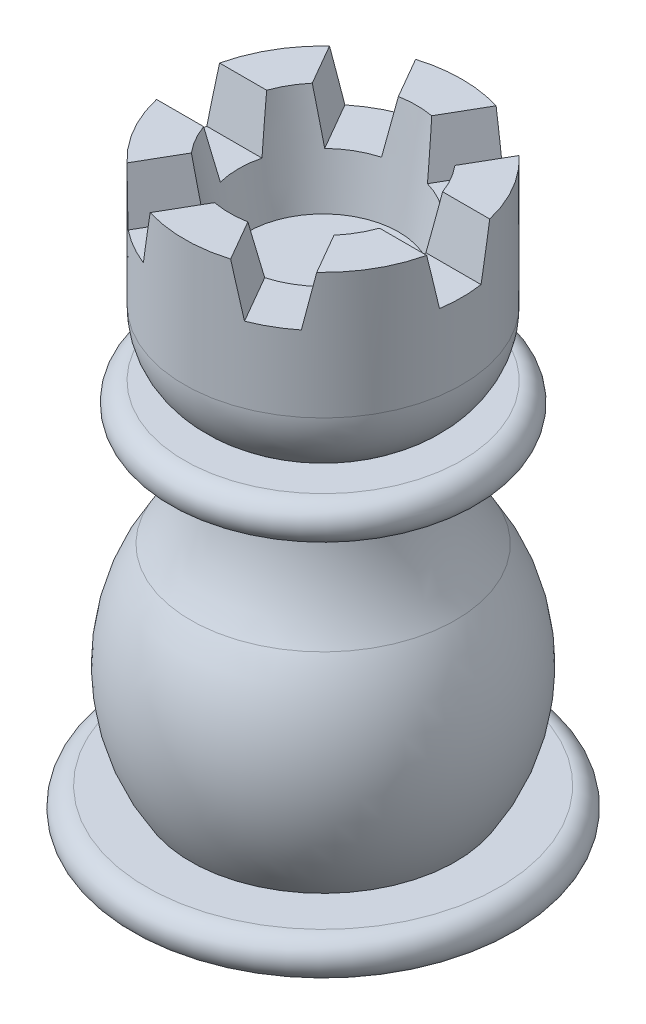
ISO-10303-21;
HEADER;
FILE_DESCRIPTION(('STEP AP214'),'2;1');
FILE_NAME('part.step','',(''),(''),'','','');
FILE_SCHEMA(('AUTOMOTIVE_DESIGN { 1 0 10303 214 1 1 1 1 }'));
ENDSEC;
DATA;
#1=APPLICATION_CONTEXT('core data for automotive mechanical design processes');
#2=APPLICATION_PROTOCOL_DEFINITION('international standard','automotive_design',2000,#1);
#3=PRODUCT_CONTEXT('',#1,'mechanical');
#4=PRODUCT('Part','Part','',(#3));
#5=PRODUCT_RELATED_PRODUCT_CATEGORY('part','',(#4));
#6=PRODUCT_DEFINITION_FORMATION('','',#4);
#7=PRODUCT_DEFINITION_CONTEXT('part definition',#1,'design');
#8=PRODUCT_DEFINITION('design','',#6,#7);
#9=PRODUCT_DEFINITION_SHAPE('','',#8);
#10=(LENGTH_UNIT() NAMED_UNIT(*) SI_UNIT(.MILLI.,.METRE.));
#11=(NAMED_UNIT(*) PLANE_ANGLE_UNIT() SI_UNIT($,.RADIAN.));
#12=(NAMED_UNIT(*) SI_UNIT($,.STERADIAN.) SOLID_ANGLE_UNIT());
#13=UNCERTAINTY_MEASURE_WITH_UNIT(LENGTH_MEASURE(1.E-05),#10,'distance_accuracy_value','');
#14=(GEOMETRIC_REPRESENTATION_CONTEXT(3) GLOBAL_UNCERTAINTY_ASSIGNED_CONTEXT((#13)) GLOBAL_UNIT_ASSIGNED_CONTEXT((#10,
#11,#12)) REPRESENTATION_CONTEXT('',''));
#15=CARTESIAN_POINT('',(0.,0.,0.));
#16=DIRECTION('',(0.,0.,1.));
#17=DIRECTION('',(1.,0.,0.));
#18=AXIS2_PLACEMENT_3D('',#15,#16,#17);
#19=CARTESIAN_POINT('',(0.,46.,-11.));
#20=DIRECTION('',(0.,1.,0.));
#21=DIRECTION('',(0.,0.,1.));
#22=AXIS2_PLACEMENT_3D('',#19,#20,#21);
#23=PLANE('',#22);
#24=DIRECTION('',(-0.500000000000004,0.,0.866025403784436));
#25=VECTOR('',#24,1.);
#26=CARTESIAN_POINT('',(8.4216333698684,46.,-19.5866968793294));
#27=LINE('',#26,#25);
#28=CARTESIAN_POINT('',(-5.65315852006722,46.,4.79155777999725));
#29=VERTEX_POINT('',#28);
#30=CARTESIAN_POINT('',(-7.52113483086827,46.,8.0269876576397));
#31=VERTEX_POINT('',#30);
#32=EDGE_CURVE('E426',#29,#31,#27,.T.);
#33=ORIENTED_EDGE('',*,*,#32,.F.);
#34=CARTESIAN_POINT('',(0.,46.,0.));
#35=DIRECTION('',(0.,-1.,0.));
#36=DIRECTION('',(0.,0.,-1.));
#37=AXIS2_PLACEMENT_3D('',#34,#35,#36);
#38=CIRCLE('',#37,7.41061584566767);
#39=CARTESIAN_POINT('',(-6.97619002121221,46.,2.5));
#40=VERTEX_POINT('',#39);
#41=EDGE_CURVE('E328',#29,#40,#38,.T.);
#42=ORIENTED_EDGE('',*,*,#41,.T.);
#43=DIRECTION('',(1.,0.,0.));
#44=VECTOR('',#43,1.);
#45=CARTESIAN_POINT('',(-15.5,46.,2.5));
#46=LINE('',#45,#44);
#47=CARTESIAN_POINT('',(-10.7121426428143,46.,2.5));
#48=VERTEX_POINT('',#47);
#49=EDGE_CURVE('E301',#48,#40,#46,.T.);
#50=ORIENTED_EDGE('',*,*,#49,.F.);
#51=CARTESIAN_POINT('',(0.,46.,0.));
#52=DIRECTION('',(0.,-1.,0.));
#53=DIRECTION('',(0.,0.,-1.));
#54=AXIS2_PLACEMENT_3D('',#51,#52,#53);
#55=CIRCLE('',#54,11.);
#56=EDGE_CURVE('E334',#31,#48,#55,.T.);
#57=ORIENTED_EDGE('',*,*,#56,.F.);
#58=EDGE_LOOP('',(#33,#42,#50,#57));
#59=FACE_BOUND('',#58,.T.);
#60=ADVANCED_FACE('F39',(#59),#23,.T.);
#61=DIRECTION('',(-0.500000000000004,0.,0.866025403784436));
#62=VECTOR('',#61,1.);
#63=CARTESIAN_POINT('',(12.7517603887906,46.,-17.0866968793294));
#64=LINE('',#63,#62);
#65=CARTESIAN_POINT('',(-1.32303150114503,46.,7.29155777999725));
#66=VERTEX_POINT('',#65);
#67=CARTESIAN_POINT('',(-3.19100781194609,46.,10.5269876576397));
#68=VERTEX_POINT('',#67);
#69=EDGE_CURVE('E258',#66,#68,#64,.T.);
#70=ORIENTED_EDGE('',*,*,#69,.T.);
#71=CARTESIAN_POINT('',(3.19100781194594,46.,10.5269876576398));
#72=VERTEX_POINT('',#71);
#73=EDGE_CURVE('E406',#72,#68,#55,.T.);
#74=ORIENTED_EDGE('',*,*,#73,.F.);
#75=DIRECTION('',(-0.499999999999992,0.,-0.866025403784443));
#76=VECTOR('',#75,1.);
#77=CARTESIAN_POINT('',(8.42163336986809,46.,19.5866968793294));
#78=LINE('',#77,#76);
#79=CARTESIAN_POINT('',(1.32303150114492,46.,7.29155777999726));
#80=VERTEX_POINT('',#79);
#81=EDGE_CURVE('E783',#72,#80,#78,.T.);
#82=ORIENTED_EDGE('',*,*,#81,.T.);
#83=EDGE_CURVE('E415',#80,#66,#38,.T.);
#84=ORIENTED_EDGE('',*,*,#83,.T.);
#85=EDGE_LOOP('',(#70,#74,#82,#84));
#86=FACE_BOUND('',#85,.T.);
#87=ADVANCED_FACE('F450',(#86),#23,.T.);
#88=CARTESIAN_POINT('',(3.19100781194609,46.,-10.5269876576397));
#89=VERTEX_POINT('',#88);
#90=CARTESIAN_POINT('',(1.32303150114504,46.,-7.29155777999727));
#91=VERTEX_POINT('',#90);
#92=EDGE_CURVE('E282',#89,#91,#27,.T.);
#93=ORIENTED_EDGE('',*,*,#92,.F.);
#94=CARTESIAN_POINT('',(-3.19100781194595,46.,-10.5269876576398));
#95=VERTEX_POINT('',#94);
#96=EDGE_CURVE('E335',#95,#89,#55,.T.);
#97=ORIENTED_EDGE('',*,*,#96,.F.);
#98=DIRECTION('',(-0.499999999999992,0.,-0.866025403784443));
#99=VECTOR('',#98,1.);
#100=CARTESIAN_POINT('',(12.7517603887903,46.,17.0866968793295));
#101=LINE('',#100,#99);
#102=CARTESIAN_POINT('',(-1.32303150114494,46.,-7.29155777999729));
#103=VERTEX_POINT('',#102);
#104=EDGE_CURVE('E274',#103,#95,#101,.T.);
#105=ORIENTED_EDGE('',*,*,#104,.F.);
#106=EDGE_CURVE('E329',#103,#91,#38,.T.);
#107=ORIENTED_EDGE('',*,*,#106,.T.);
#108=EDGE_LOOP('',(#93,#97,#105,#107));
#109=FACE_BOUND('',#108,.T.);
#110=ADVANCED_FACE('F458',(#109),#23,.T.);
#111=CARTESIAN_POINT('',(7.52113483086827,46.,-8.0269876576397));
#112=VERTEX_POINT('',#111);
#113=CARTESIAN_POINT('',(5.65315852006722,46.,-4.79155777999725));
#114=VERTEX_POINT('',#113);
#115=EDGE_CURVE('E422',#112,#114,#64,.T.);
#116=ORIENTED_EDGE('',*,*,#115,.T.);
#117=CARTESIAN_POINT('',(6.97619002121226,46.,-2.5));
#118=VERTEX_POINT('',#117);
#119=EDGE_CURVE('E325',#114,#118,#38,.T.);
#120=ORIENTED_EDGE('',*,*,#119,.T.);
#121=DIRECTION('',(1.,0.,0.));
#122=VECTOR('',#121,1.);
#123=CARTESIAN_POINT('',(-15.5,46.,-2.5));
#124=LINE('',#123,#122);
#125=CARTESIAN_POINT('',(10.7121426428143,46.,-2.5));
#126=VERTEX_POINT('',#125);
#127=EDGE_CURVE('E303',#118,#126,#124,.T.);
#128=ORIENTED_EDGE('',*,*,#127,.T.);
#129=EDGE_CURVE('E408',#112,#126,#55,.T.);
#130=ORIENTED_EDGE('',*,*,#129,.F.);
#131=EDGE_LOOP('',(#116,#120,#128,#130));
#132=FACE_BOUND('',#131,.T.);
#133=ADVANCED_FACE('F421',(#132),#23,.T.);
#134=CARTESIAN_POINT('',(7.52113483086816,46.,8.0269876576398));
#135=VERTEX_POINT('',#134);
#136=CARTESIAN_POINT('',(5.65315852006716,46.,4.79155777999732));
#137=VERTEX_POINT('',#136);
#138=EDGE_CURVE('E272',#135,#137,#101,.T.);
#139=ORIENTED_EDGE('',*,*,#138,.F.);
#140=CARTESIAN_POINT('',(10.7121426428143,46.,2.5));
#141=VERTEX_POINT('',#140);
#142=EDGE_CURVE('E336',#141,#135,#55,.T.);
#143=ORIENTED_EDGE('',*,*,#142,.F.);
#144=CARTESIAN_POINT('',(6.97619002121221,46.,2.5));
#145=VERTEX_POINT('',#144);
#146=EDGE_CURVE('E299',#145,#141,#46,.T.);
#147=ORIENTED_EDGE('',*,*,#146,.F.);
#148=EDGE_CURVE('E330',#145,#137,#38,.T.);
#149=ORIENTED_EDGE('',*,*,#148,.T.);
#150=EDGE_LOOP('',(#139,#143,#147,#149));
#151=FACE_BOUND('',#150,.T.);
#152=ADVANCED_FACE('F404',(#151),#23,.T.);
#153=CARTESIAN_POINT('',(0.,0.,0.));
#154=DIRECTION('',(0.,-1.,0.));
#155=DIRECTION('',(0.,0.,-1.));
#156=AXIS2_PLACEMENT_3D('',#153,#154,#155);
#157=PLANE('',#156);
#158=CARTESIAN_POINT('',(0.,0.,0.));
#159=DIRECTION('',(0.,-1.,0.));
#160=DIRECTION('',(0.,0.,-1.));
#161=AXIS2_PLACEMENT_3D('',#158,#159,#160);
#162=CIRCLE('',#161,14.);
#163=CARTESIAN_POINT('',(0.,0.,-14.));
#164=VERTEX_POINT('',#163);
#165=EDGE_CURVE('E361',#164,#164,#162,.T.);
#166=ORIENTED_EDGE('',*,*,#165,.T.);
#167=EDGE_LOOP('',(#166));
#168=FACE_BOUND('',#167,.T.);
#169=ADVANCED_FACE('F41',(#168),#157,.T.);
#170=CARTESIAN_POINT('',(0.,1.5,0.));
#171=DIRECTION('',(0.,-1.,0.));
#172=DIRECTION('',(0.,0.,-1.));
#173=AXIS2_PLACEMENT_3D('',#170,#171,#172);
#174=TOROIDAL_SURFACE('',#173,14.,1.5);
#175=CARTESIAN_POINT('',(0.,3.,0.));
#176=DIRECTION('',(0.,-1.,0.));
#177=DIRECTION('',(0.,0.,-1.));
#178=AXIS2_PLACEMENT_3D('',#175,#176,#177);
#179=CIRCLE('',#178,14.);
#180=CARTESIAN_POINT('',(0.,3.,-14.));
#181=VERTEX_POINT('',#180);
#182=EDGE_CURVE('E358',#181,#181,#179,.T.);
#183=ORIENTED_EDGE('',*,*,#182,.T.);
#184=EDGE_LOOP('',(#183));
#185=FACE_BOUND('',#184,.T.);
#186=ORIENTED_EDGE('',*,*,#165,.F.);
#187=EDGE_LOOP('',(#186));
#188=FACE_BOUND('',#187,.T.);
#189=ADVANCED_FACE('F474',(#185,#188),#174,.T.);
#190=CARTESIAN_POINT('',(0.,3.,-14.));
#191=DIRECTION('',(0.,1.,0.));
#192=DIRECTION('',(0.,0.,1.));
#193=AXIS2_PLACEMENT_3D('',#190,#191,#192);
#194=PLANE('',#193);
#195=CARTESIAN_POINT('',(0.,2.99999999999999,0.));
#196=DIRECTION('',(0.,-1.,0.));
#197=DIRECTION('',(0.,0.,-1.));
#198=AXIS2_PLACEMENT_3D('',#195,#196,#197);
#199=CIRCLE('',#198,10.5);
#200=CARTESIAN_POINT('',(0.,2.99999999999999,-10.5));
#201=VERTEX_POINT('',#200);
#202=EDGE_CURVE('E355',#201,#201,#199,.T.);
#203=ORIENTED_EDGE('',*,*,#202,.T.);
#204=EDGE_LOOP('',(#203));
#205=FACE_BOUND('',#204,.T.);
#206=ORIENTED_EDGE('',*,*,#182,.F.);
#207=EDGE_LOOP('',(#206));
#208=FACE_BOUND('',#207,.T.);
#209=ADVANCED_FACE('F721',(#205,#208),#194,.T.);
#210=CARTESIAN_POINT('',(0.,11.2915619758885,0.));
#211=DIRECTION('',(0.,-1.,0.));
#212=DIRECTION('',(0.,0.,-1.));
#213=AXIS2_PLACEMENT_3D('',#210,#211,#212);
#214=DEGENERATE_TOROIDAL_SURFACE('',#213,2.,15.,.F.);
#215=CARTESIAN_POINT('',(0.,19.5832509406104,0.));
#216=DIRECTION('',(0.,-1.,0.));
#217=DIRECTION('',(0.,0.,-1.));
#218=AXIS2_PLACEMENT_3D('',#215,#216,#217);
#219=CIRCLE('',#218,10.4999157642085);
#220=CARTESIAN_POINT('',(0.,19.5832509406104,-10.4999157642085));
#221=VERTEX_POINT('',#220);
#222=EDGE_CURVE('E352',#221,#221,#219,.T.);
#223=ORIENTED_EDGE('',*,*,#222,.T.);
#224=EDGE_LOOP('',(#223));
#225=FACE_BOUND('',#224,.T.);
#226=ORIENTED_EDGE('',*,*,#202,.F.);
#227=EDGE_LOOP('',(#226));
#228=FACE_BOUND('',#227,.T.);
#229=ADVANCED_FACE('F712',(#225,#228),#214,.F.);
#230=CARTESIAN_POINT('',(0.,27.8749399053323,0.));
#231=DIRECTION('',(0.,-1.,0.));
#232=DIRECTION('',(0.,0.,-1.));
#233=AXIS2_PLACEMENT_3D('',#230,#231,#232);
#234=TOROIDAL_SURFACE('',#233,22.999831528417,15.);
#235=CARTESIAN_POINT('',(0.,27.8038475772934,0.));
#236=DIRECTION('',(0.,-1.,0.));
#237=DIRECTION('',(0.,0.,-1.));
#238=AXIS2_PLACEMENT_3D('',#235,#236,#237);
#239=CIRCLE('',#238,8.);
#240=CARTESIAN_POINT('',(0.,27.8038475772934,-8.));
#241=VERTEX_POINT('',#240);
#242=EDGE_CURVE('E349',#241,#241,#239,.T.);
#243=ORIENTED_EDGE('',*,*,#242,.T.);
#244=EDGE_LOOP('',(#243));
#245=FACE_BOUND('',#244,.T.);
#246=ORIENTED_EDGE('',*,*,#222,.F.);
#247=EDGE_LOOP('',(#246));
#248=FACE_BOUND('',#247,.T.);
#249=ADVANCED_FACE('F703',(#245,#248),#234,.F.);
#250=CARTESIAN_POINT('',(0.,27.8038475772934,-8.));
#251=DIRECTION('',(0.,-1.,0.));
#252=DIRECTION('',(0.,0.,-1.));
#253=AXIS2_PLACEMENT_3D('',#250,#251,#252);
#254=PLANE('',#253);
#255=CARTESIAN_POINT('',(0.,27.8038475772934,0.));
#256=DIRECTION('',(0.,-1.,0.));
#257=DIRECTION('',(0.,0.,-1.));
#258=AXIS2_PLACEMENT_3D('',#255,#256,#257);
#259=CIRCLE('',#258,11.);
#260=CARTESIAN_POINT('',(0.,27.8038475772934,-11.));
#261=VERTEX_POINT('',#260);
#262=EDGE_CURVE('E346',#261,#261,#259,.T.);
#263=ORIENTED_EDGE('',*,*,#262,.T.);
#264=EDGE_LOOP('',(#263));
#265=FACE_BOUND('',#264,.T.);
#266=ORIENTED_EDGE('',*,*,#242,.F.);
#267=EDGE_LOOP('',(#266));
#268=FACE_BOUND('',#267,.T.);
#269=ADVANCED_FACE('F694',(#265,#268),#254,.T.);
#270=CARTESIAN_POINT('',(0.,29.3038475772934,0.));
#271=DIRECTION('',(0.,-1.,0.));
#272=DIRECTION('',(0.,0.,-1.));
#273=AXIS2_PLACEMENT_3D('',#270,#271,#272);
#274=TOROIDAL_SURFACE('',#273,11.,1.5);
#275=CARTESIAN_POINT('',(0.,30.8038475772934,0.));
#276=DIRECTION('',(0.,-1.,0.));
#277=DIRECTION('',(0.,0.,-1.));
#278=AXIS2_PLACEMENT_3D('',#275,#276,#277);
#279=CIRCLE('',#278,11.);
#280=CARTESIAN_POINT('',(0.,30.8038475772934,-11.));
#281=VERTEX_POINT('',#280);
#282=EDGE_CURVE('E343',#281,#281,#279,.T.);
#283=ORIENTED_EDGE('',*,*,#282,.T.);
#284=EDGE_LOOP('',(#283));
#285=FACE_BOUND('',#284,.T.);
#286=ORIENTED_EDGE('',*,*,#262,.F.);
#287=EDGE_LOOP('',(#286));
#288=FACE_BOUND('',#287,.T.);
#289=ADVANCED_FACE('F685',(#285,#288),#274,.T.);
#290=CARTESIAN_POINT('',(0.,30.8038475772934,-11.));
#291=DIRECTION('',(0.,1.,0.));
#292=DIRECTION('',(0.,0.,1.));
#293=AXIS2_PLACEMENT_3D('',#290,#291,#292);
#294=PLANE('',#293);
#295=CARTESIAN_POINT('',(0.,30.8038475772934,0.));
#296=DIRECTION('',(0.,-1.,0.));
#297=DIRECTION('',(0.,0.,-1.));
#298=AXIS2_PLACEMENT_3D('',#295,#296,#297);
#299=CIRCLE('',#298,8.);
#300=CARTESIAN_POINT('',(0.,30.8038475772934,-8.));
#301=VERTEX_POINT('',#300);
#302=EDGE_CURVE('E340',#301,#301,#299,.T.);
#303=ORIENTED_EDGE('',*,*,#302,.T.);
#304=EDGE_LOOP('',(#303));
#305=FACE_BOUND('',#304,.T.);
#306=ORIENTED_EDGE('',*,*,#282,.F.);
#307=EDGE_LOOP('',(#306));
#308=FACE_BOUND('',#307,.T.);
#309=ADVANCED_FACE('F677',(#305,#308),#294,.T.);
#310=CARTESIAN_POINT('',(0.,36.,0.));
#311=DIRECTION('',(0.,-1.,0.));
#312=DIRECTION('',(0.,0.,-1.));
#313=AXIS2_PLACEMENT_3D('',#310,#311,#312);
#314=DEGENERATE_TOROIDAL_SURFACE('',#313,5.,6.,.T.);
#315=CARTESIAN_POINT('',(0.,36.,0.));
#316=DIRECTION('',(0.,-1.,0.));
#317=DIRECTION('',(0.,0.,-1.));
#318=AXIS2_PLACEMENT_3D('',#315,#316,#317);
#319=CIRCLE('',#318,11.);
#320=CARTESIAN_POINT('',(0.,36.,-11.));
#321=VERTEX_POINT('',#320);
#322=EDGE_CURVE('E337',#321,#321,#319,.T.);
#323=ORIENTED_EDGE('',*,*,#322,.T.);
#324=EDGE_LOOP('',(#323));
#325=FACE_BOUND('',#324,.T.);
#326=ORIENTED_EDGE('',*,*,#302,.F.);
#327=EDGE_LOOP('',(#326));
#328=FACE_BOUND('',#327,.T.);
#329=ADVANCED_FACE('F468',(#325,#328),#314,.T.);
#330=CARTESIAN_POINT('',(0.,0.,0.));
#331=DIRECTION('',(0.,-1.,0.));
#332=DIRECTION('',(0.,0.,-1.));
#333=AXIS2_PLACEMENT_3D('',#330,#331,#332);
#334=CYLINDRICAL_SURFACE('',#333,11.);
#335=CARTESIAN_POINT('',(0.,34.2384247263037,0.));
#336=DIRECTION('',(-0.847100670886272,-0.207911690817757,-0.489073800366907));
#337=DIRECTION('',(0.180056805991953,-0.978147600733806,0.103955845408879));
#338=AXIS2_PLACEMENT_3D('',#335,#336,#337);
#339=ELLIPSE('',#338,52.9070777921861,11.);
#340=CARTESIAN_POINT('',(-6.8665361240012,42.,8.59364193213719));
#341=VERTEX_POINT('',#340);
#342=EDGE_CURVE('E271',#31,#341,#339,.F.);
#343=ORIENTED_EDGE('',*,*,#342,.F.);
#344=ORIENTED_EDGE('',*,*,#56,.T.);
#345=CARTESIAN_POINT('',(0.,34.2384247263037,0.));
#346=DIRECTION('',(0.,-0.207911690817757,0.978147600733806));
#347=DIRECTION('',(0.,-0.978147600733806,-0.207911690817757));
#348=AXIS2_PLACEMENT_3D('',#345,#346,#347);
#349=ELLIPSE('',#348,52.9070777921861,11.);
#350=CARTESIAN_POINT('',(-10.8755802862586,42.,1.64977375331992));
#351=VERTEX_POINT('',#350);
#352=EDGE_CURVE('E321',#351,#48,#349,.F.);
#353=ORIENTED_EDGE('',*,*,#352,.F.);
#354=CARTESIAN_POINT('',(0.,42.,0.));
#355=DIRECTION('',(0.,-1.,0.));
#356=DIRECTION('',(0.,0.,-1.));
#357=AXIS2_PLACEMENT_3D('',#354,#355,#356);
#358=CIRCLE('',#357,11.);
#359=CARTESIAN_POINT('',(-10.8755802862586,42.,-1.64977375331992));
#360=VERTEX_POINT('',#359);
#361=EDGE_CURVE('E315',#360,#351,#358,.F.);
#362=ORIENTED_EDGE('',*,*,#361,.F.);
#363=CARTESIAN_POINT('',(0.,34.2384247263037,0.));
#364=DIRECTION('',(0.,-0.207911690817756,-0.978147600733806));
#365=DIRECTION('',(0.,-0.978147600733806,0.207911690817756));
#366=AXIS2_PLACEMENT_3D('',#363,#364,#365);
#367=ELLIPSE('',#366,52.9070777921862,11.);
#368=CARTESIAN_POINT('',(-10.7121426428143,46.,-2.5));
#369=VERTEX_POINT('',#368);
#370=EDGE_CURVE('E316',#369,#360,#367,.F.);
#371=ORIENTED_EDGE('',*,*,#370,.F.);
#372=CARTESIAN_POINT('',(-7.52113483086816,46.,-8.02698765763981));
#373=VERTEX_POINT('',#372);
#374=EDGE_CURVE('E331',#369,#373,#55,.T.);
#375=ORIENTED_EDGE('',*,*,#374,.T.);
#376=CARTESIAN_POINT('',(0.,34.2384247263037,0.));
#377=DIRECTION('',(-0.847100670886279,-0.207911690817756,0.489073800366895));
#378=DIRECTION('',(0.180056805991954,-0.978147600733806,-0.103955845408877));
#379=AXIS2_PLACEMENT_3D('',#376,#377,#378);
#380=ELLIPSE('',#379,52.9070777921862,11.);
#381=CARTESIAN_POINT('',(-6.86653612400107,42.,-8.59364193213728));
#382=VERTEX_POINT('',#381);
#383=EDGE_CURVE('E279',#382,#373,#380,.F.);
#384=ORIENTED_EDGE('',*,*,#383,.F.);
#385=CARTESIAN_POINT('',(0.,42.,0.));
#386=DIRECTION('',(0.,-1.,0.));
#387=DIRECTION('',(0.,0.,-1.));
#388=AXIS2_PLACEMENT_3D('',#385,#386,#387);
#389=CIRCLE('',#388,11.);
#390=CARTESIAN_POINT('',(-4.00904416225735,42.,-10.2434156854572));
#391=VERTEX_POINT('',#390);
#392=EDGE_CURVE('E218',#391,#382,#389,.F.);
#393=ORIENTED_EDGE('',*,*,#392,.F.);
#394=CARTESIAN_POINT('',(0.,34.2384247263037,0.));
#395=DIRECTION('',(0.847100670886279,-0.207911690817757,-0.489073800366895));
#396=DIRECTION('',(-0.180056805991954,-0.978147600733806,0.103955845408877));
#397=AXIS2_PLACEMENT_3D('',#394,#395,#396);
#398=ELLIPSE('',#397,52.9070777921861,11.);
#399=EDGE_CURVE('E281',#95,#391,#398,.F.);
#400=ORIENTED_EDGE('',*,*,#399,.F.);
#401=ORIENTED_EDGE('',*,*,#96,.T.);
#402=CARTESIAN_POINT('',(0.,34.2384247263037,0.));
#403=DIRECTION('',(-0.847100670886272,-0.207911690817757,-0.489073800366907));
#404=DIRECTION('',(0.180056805991953,-0.978147600733806,0.103955845408879));
#405=AXIS2_PLACEMENT_3D('',#402,#403,#404);
#406=ELLIPSE('',#405,52.9070777921861,11.);
#407=CARTESIAN_POINT('',(4.00904416225749,42.,-10.2434156854571));
#408=VERTEX_POINT('',#407);
#409=EDGE_CURVE('E296',#408,#89,#406,.F.);
#410=ORIENTED_EDGE('',*,*,#409,.F.);
#411=CARTESIAN_POINT('',(6.8665361240012,42.,-8.59364193213719));
#412=VERTEX_POINT('',#411);
#413=EDGE_CURVE('E288',#412,#408,#389,.F.);
#414=ORIENTED_EDGE('',*,*,#413,.F.);
#415=CARTESIAN_POINT('',(0.,34.2384247263037,0.));
#416=DIRECTION('',(0.847100670886272,-0.207911690817756,0.489073800366907));
#417=DIRECTION('',(-0.180056805991952,-0.978147600733806,-0.103955845408879));
#418=AXIS2_PLACEMENT_3D('',#415,#416,#417);
#419=ELLIPSE('',#418,52.9070777921862,11.);
#420=EDGE_CURVE('E294',#112,#412,#419,.F.);
#421=ORIENTED_EDGE('',*,*,#420,.F.);
#422=ORIENTED_EDGE('',*,*,#129,.T.);
#423=CARTESIAN_POINT('',(10.8755802862586,42.,-1.64977375331992));
#424=VERTEX_POINT('',#423);
#425=EDGE_CURVE('E318',#424,#126,#367,.F.);
#426=ORIENTED_EDGE('',*,*,#425,.F.);
#427=CARTESIAN_POINT('',(10.8755802862586,42.,1.64977375331992));
#428=VERTEX_POINT('',#427);
#429=EDGE_CURVE('E313',#428,#424,#358,.F.);
#430=ORIENTED_EDGE('',*,*,#429,.F.);
#431=EDGE_CURVE('E319',#141,#428,#349,.F.);
#432=ORIENTED_EDGE('',*,*,#431,.F.);
#433=ORIENTED_EDGE('',*,*,#142,.T.);
#434=CARTESIAN_POINT('',(0.,34.2384247263037,0.));
#435=DIRECTION('',(0.847100670886279,-0.207911690817757,-0.489073800366895));
#436=DIRECTION('',(-0.180056805991954,-0.978147600733806,0.103955845408877));
#437=AXIS2_PLACEMENT_3D('',#434,#435,#436);
#438=ELLIPSE('',#437,52.9070777921861,11.);
#439=CARTESIAN_POINT('',(6.86653612400108,42.,8.59364193213728));
#440=VERTEX_POINT('',#439);
#441=EDGE_CURVE('E284',#440,#135,#438,.F.);
#442=ORIENTED_EDGE('',*,*,#441,.F.);
#443=CARTESIAN_POINT('',(4.00904416225735,42.,10.2434156854572));
#444=VERTEX_POINT('',#443);
#445=EDGE_CURVE('E790',#444,#440,#389,.F.);
#446=ORIENTED_EDGE('',*,*,#445,.F.);
#447=CARTESIAN_POINT('',(0.,34.2384247263037,0.));
#448=DIRECTION('',(-0.847100670886279,-0.207911690817756,0.489073800366895));
#449=DIRECTION('',(0.180056805991954,-0.978147600733806,-0.103955845408877));
#450=AXIS2_PLACEMENT_3D('',#447,#448,#449);
#451=ELLIPSE('',#450,52.9070777921862,11.);
#452=EDGE_CURVE('E286',#72,#444,#451,.F.);
#453=ORIENTED_EDGE('',*,*,#452,.F.);
#454=ORIENTED_EDGE('',*,*,#73,.T.);
#455=CARTESIAN_POINT('',(0.,34.2384247263037,0.));
#456=DIRECTION('',(0.847100670886272,-0.207911690817756,0.489073800366907));
#457=DIRECTION('',(-0.180056805991952,-0.978147600733806,-0.103955845408879));
#458=AXIS2_PLACEMENT_3D('',#455,#456,#457);
#459=ELLIPSE('',#458,52.9070777921862,11.);
#460=CARTESIAN_POINT('',(-4.00904416225749,42.,10.2434156854571));
#461=VERTEX_POINT('',#460);
#462=EDGE_CURVE('E291',#461,#68,#459,.F.);
#463=ORIENTED_EDGE('',*,*,#462,.F.);
#464=EDGE_CURVE('E290',#341,#461,#389,.F.);
#465=ORIENTED_EDGE('',*,*,#464,.F.);
#466=EDGE_LOOP('',(#343,#344,#353,#362,#371,#375,#384,#393,#400,#401,#410,#414,#421,#422,#426,
#430,#432,#433,#442,#446,#453,#454,#463,#465));
#467=FACE_BOUND('',#466,.T.);
#468=ORIENTED_EDGE('',*,*,#322,.F.);
#469=EDGE_LOOP('',(#468));
#470=FACE_BOUND('',#469,.T.);
#471=ADVANCED_FACE('F399',(#467,#470),#334,.T.);
#472=CARTESIAN_POINT('',(-5.65315852006715,46.,-4.79155777999731));
#473=VERTEX_POINT('',#472);
#474=EDGE_CURVE('E205',#473,#373,#78,.T.);
#475=ORIENTED_EDGE('',*,*,#474,.T.);
#476=ORIENTED_EDGE('',*,*,#374,.F.);
#477=CARTESIAN_POINT('',(-6.97619002121227,46.,-2.5));
#478=VERTEX_POINT('',#477);
#479=EDGE_CURVE('E302',#369,#478,#124,.T.);
#480=ORIENTED_EDGE('',*,*,#479,.T.);
#481=EDGE_CURVE('E326',#478,#473,#38,.T.);
#482=ORIENTED_EDGE('',*,*,#481,.T.);
#483=EDGE_LOOP('',(#475,#476,#480,#482));
#484=FACE_BOUND('',#483,.T.);
#485=ADVANCED_FACE('F453',(#484),#23,.T.);
#486=CARTESIAN_POINT('',(0.,46.,0.));
#487=DIRECTION('',(0.,1.,0.));
#488=DIRECTION('',(0.,0.,1.));
#489=AXIS2_PLACEMENT_3D('',#486,#487,#488);
#490=CONICAL_SURFACE('',#489,7.41061584566767,0.174532925199427);
#491=CARTESIAN_POINT('',(-12.2946594059972,101.028410995154,-7.09832491764732));
#492=DIRECTION('',(-0.847100670886272,-0.207911690817757,-0.489073800366907));
#493=DIRECTION('',(-0.180056805991953,0.978147600733806,-0.103955845408879));
#494=AXIS2_PLACEMENT_3D('',#491,#492,#493);
#495=ELLIPSE('',#494,82.3119149400217,9.55671284905615);
#496=CARTESIAN_POINT('',(-4.67833829772006,42.,4.80357212000653));
#497=VERTEX_POINT('',#496);
#498=EDGE_CURVE('E11',#497,#29,#495,.T.);
#499=ORIENTED_EDGE('',*,*,#498,.F.);
#500=CARTESIAN_POINT('',(0.,42.,0.));
#501=DIRECTION('',(0.,-1.,0.));
#502=DIRECTION('',(0.,0.,-1.));
#503=AXIS2_PLACEMENT_3D('',#500,#501,#502);
#504=CIRCLE('',#503,6.70530792283384);
#505=CARTESIAN_POINT('',(-1.82084633597635,42.,6.45334587332647));
#506=VERTEX_POINT('',#505);
#507=EDGE_CURVE('E229',#506,#497,#504,.T.);
#508=ORIENTED_EDGE('',*,*,#507,.F.);
#509=CARTESIAN_POINT('',(12.2946594059972,101.028410995154,7.09832491764732));
#510=DIRECTION('',(0.847100670886272,-0.207911690817756,0.489073800366907));
#511=DIRECTION('',(0.180056805991952,0.978147600733806,0.103955845408879));
#512=AXIS2_PLACEMENT_3D('',#509,#510,#511);
#513=ELLIPSE('',#512,82.3119149400216,9.55671284905614);
#514=EDGE_CURVE('E47',#66,#506,#513,.T.);
#515=ORIENTED_EDGE('',*,*,#514,.F.);
#516=ORIENTED_EDGE('',*,*,#83,.F.);
#517=CARTESIAN_POINT('',(-12.2946594059973,101.028410995154,7.09832491764715));
#518=DIRECTION('',(-0.847100670886279,-0.207911690817756,0.489073800366895));
#519=DIRECTION('',(-0.180056805991954,0.978147600733806,0.103955845408877));
#520=AXIS2_PLACEMENT_3D('',#517,#518,#519);
#521=ELLIPSE('',#520,82.3119149400215,9.55671284905613);
#522=CARTESIAN_POINT('',(1.82084633597625,42.,6.45334587332646));
#523=VERTEX_POINT('',#522);
#524=EDGE_CURVE('E235',#523,#80,#521,.T.);
#525=ORIENTED_EDGE('',*,*,#524,.F.);
#526=CARTESIAN_POINT('',(4.67833829771999,42.,4.80357212000658));
#527=VERTEX_POINT('',#526);
#528=EDGE_CURVE('E230',#527,#523,#504,.T.);
#529=ORIENTED_EDGE('',*,*,#528,.F.);
#530=CARTESIAN_POINT('',(12.2946594059973,101.028410995154,-7.09832491764715));
#531=DIRECTION('',(0.847100670886279,-0.207911690817757,-0.489073800366895));
#532=DIRECTION('',(0.180056805991954,0.978147600733806,-0.103955845408877));
#533=AXIS2_PLACEMENT_3D('',#530,#531,#532);
#534=ELLIPSE('',#533,82.3119149400216,9.55671284905615);
#535=EDGE_CURVE('E231',#137,#527,#534,.T.);
#536=ORIENTED_EDGE('',*,*,#535,.F.);
#537=ORIENTED_EDGE('',*,*,#148,.F.);
#538=CARTESIAN_POINT('',(0.,101.028410995155,14.1966498352948));
#539=DIRECTION('',(0.,-0.207911690817757,0.978147600733806));
#540=DIRECTION('',(0.,0.978147600733806,0.207911690817757));
#541=AXIS2_PLACEMENT_3D('',#538,#539,#540);
#542=ELLIPSE('',#541,82.3119149400238,9.55671284905627);
#543=CARTESIAN_POINT('',(6.49918463369636,42.,1.64977375331992));
#544=VERTEX_POINT('',#543);
#545=EDGE_CURVE('E211',#544,#145,#542,.T.);
#546=ORIENTED_EDGE('',*,*,#545,.F.);
#547=CARTESIAN_POINT('',(0.,42.,0.));
#548=DIRECTION('',(0.,-1.,0.));
#549=DIRECTION('',(0.,0.,-1.));
#550=AXIS2_PLACEMENT_3D('',#547,#548,#549);
#551=CIRCLE('',#550,6.70530792283384);
#552=CARTESIAN_POINT('',(6.49918463369636,42.,-1.64977375331992));
#553=VERTEX_POINT('',#552);
#554=EDGE_CURVE('E367',#553,#544,#551,.T.);
#555=ORIENTED_EDGE('',*,*,#554,.F.);
#556=CARTESIAN_POINT('',(0.,101.028410995155,-14.1966498352948));
#557=DIRECTION('',(0.,-0.207911690817756,-0.978147600733806));
#558=DIRECTION('',(0.,0.978147600733806,-0.207911690817756));
#559=AXIS2_PLACEMENT_3D('',#556,#557,#558);
#560=ELLIPSE('',#559,82.3119149400237,9.55671284905626);
#561=EDGE_CURVE('E370',#118,#553,#560,.T.);
#562=ORIENTED_EDGE('',*,*,#561,.F.);
#563=ORIENTED_EDGE('',*,*,#119,.F.);
#564=CARTESIAN_POINT('',(12.2946594059972,101.028410995154,7.09832491764732));
#565=DIRECTION('',(0.847100670886272,-0.207911690817756,0.489073800366907));
#566=DIRECTION('',(0.180056805991952,0.978147600733806,0.103955845408879));
#567=AXIS2_PLACEMENT_3D('',#564,#565,#566);
#568=ELLIPSE('',#567,82.3119149400216,9.55671284905614);
#569=CARTESIAN_POINT('',(4.67833829772006,42.,-4.80357212000653));
#570=VERTEX_POINT('',#569);
#571=EDGE_CURVE('E243',#570,#114,#568,.T.);
#572=ORIENTED_EDGE('',*,*,#571,.F.);
#573=CARTESIAN_POINT('',(1.82084633597636,42.,-6.45334587332647));
#574=VERTEX_POINT('',#573);
#575=EDGE_CURVE('E234',#574,#570,#504,.T.);
#576=ORIENTED_EDGE('',*,*,#575,.F.);
#577=CARTESIAN_POINT('',(-12.2946594059972,101.028410995154,-7.09832491764732));
#578=DIRECTION('',(-0.847100670886272,-0.207911690817757,-0.489073800366907));
#579=DIRECTION('',(-0.180056805991953,0.978147600733806,-0.103955845408879));
#580=AXIS2_PLACEMENT_3D('',#577,#578,#579);
#581=ELLIPSE('',#580,82.3119149400217,9.55671284905615);
#582=EDGE_CURVE('E233',#91,#574,#581,.T.);
#583=ORIENTED_EDGE('',*,*,#582,.F.);
#584=ORIENTED_EDGE('',*,*,#106,.F.);
#585=CARTESIAN_POINT('',(12.2946594059973,101.028410995154,-7.09832491764715));
#586=DIRECTION('',(0.847100670886279,-0.207911690817757,-0.489073800366895));
#587=DIRECTION('',(0.180056805991954,0.978147600733806,-0.103955845408877));
#588=AXIS2_PLACEMENT_3D('',#585,#586,#587);
#589=ELLIPSE('',#588,82.3119149400216,9.55671284905615);
#590=CARTESIAN_POINT('',(-1.82084633597627,42.,-6.45334587332649));
#591=VERTEX_POINT('',#590);
#592=EDGE_CURVE('E227',#591,#103,#589,.T.);
#593=ORIENTED_EDGE('',*,*,#592,.F.);
#594=CARTESIAN_POINT('',(-4.67833829771998,42.,-4.80357212000657));
#595=VERTEX_POINT('',#594);
#596=EDGE_CURVE('E210',#595,#591,#504,.T.);
#597=ORIENTED_EDGE('',*,*,#596,.F.);
#598=CARTESIAN_POINT('',(-12.2946594059973,101.028410995154,7.09832491764715));
#599=DIRECTION('',(-0.847100670886279,-0.207911690817756,0.489073800366895));
#600=DIRECTION('',(-0.180056805991954,0.978147600733806,0.103955845408877));
#601=AXIS2_PLACEMENT_3D('',#598,#599,#600);
#602=ELLIPSE('',#601,82.3119149400215,9.55671284905613);
#603=EDGE_CURVE('E199',#473,#595,#602,.T.);
#604=ORIENTED_EDGE('',*,*,#603,.F.);
#605=ORIENTED_EDGE('',*,*,#481,.F.);
#606=CARTESIAN_POINT('',(-6.49918463369636,42.,-1.64977375331992));
#607=VERTEX_POINT('',#606);
#608=EDGE_CURVE('E366',#607,#478,#560,.T.);
#609=ORIENTED_EDGE('',*,*,#608,.F.);
#610=CARTESIAN_POINT('',(-6.49918463369636,42.,1.64977375331992));
#611=VERTEX_POINT('',#610);
#612=EDGE_CURVE('E364',#611,#607,#551,.T.);
#613=ORIENTED_EDGE('',*,*,#612,.F.);
#614=EDGE_CURVE('E369',#40,#611,#542,.T.);
#615=ORIENTED_EDGE('',*,*,#614,.F.);
#616=ORIENTED_EDGE('',*,*,#41,.F.);
#617=EDGE_LOOP('',(#499,#508,#515,#516,#525,#529,#536,#537,#546,#555,#562,#563,#572,#576,#583,
#584,#593,#597,#604,#605,#609,#613,#615,#616));
#618=FACE_BOUND('',#617,.T.);
#619=CARTESIAN_POINT('',(0.,38.,0.));
#620=DIRECTION('',(0.,-1.,0.));
#621=DIRECTION('',(0.,0.,-1.));
#622=AXIS2_PLACEMENT_3D('',#619,#620,#621);
#623=CIRCLE('',#622,6.);
#624=CARTESIAN_POINT('',(0.,38.,-6.));
#625=VERTEX_POINT('',#624);
#626=EDGE_CURVE('E322',#625,#625,#623,.T.);
#627=ORIENTED_EDGE('',*,*,#626,.T.);
#628=EDGE_LOOP('',(#627));
#629=FACE_BOUND('',#628,.T.);
#630=ADVANCED_FACE('F224',(#618,#629),#490,.F.);
#631=CARTESIAN_POINT('',(0.,38.,-6.));
#632=DIRECTION('',(0.,1.,0.));
#633=DIRECTION('',(0.,0.,1.));
#634=AXIS2_PLACEMENT_3D('',#631,#632,#633);
#635=PLANE('',#634);
#636=ORIENTED_EDGE('',*,*,#626,.F.);
#637=EDGE_LOOP('',(#636));
#638=FACE_BOUND('',#637,.T.);
#639=ADVANCED_FACE('F467',(#638),#635,.T.);
#640=CARTESIAN_POINT('',(-15.5,42.,-1.64977375331992));
#641=DIRECTION('',(0.,-1.,0.));
#642=DIRECTION('',(0.,0.,-1.));
#643=AXIS2_PLACEMENT_3D('',#640,#641,#642);
#644=PLANE('',#643);
#645=ORIENTED_EDGE('',*,*,#361,.T.);
#646=DIRECTION('',(1.,0.,0.));
#647=VECTOR('',#646,1.);
#648=CARTESIAN_POINT('',(-15.5,42.,1.64977375331992));
#649=LINE('',#648,#647);
#650=EDGE_CURVE('E310',#351,#611,#649,.T.);
#651=ORIENTED_EDGE('',*,*,#650,.T.);
#652=ORIENTED_EDGE('',*,*,#612,.T.);
#653=DIRECTION('',(1.,0.,0.));
#654=VECTOR('',#653,1.);
#655=CARTESIAN_POINT('',(-15.5,42.,-1.64977375331992));
#656=LINE('',#655,#654);
#657=EDGE_CURVE('E306',#360,#607,#656,.T.);
#658=ORIENTED_EDGE('',*,*,#657,.F.);
#659=EDGE_LOOP('',(#645,#651,#652,#658));
#660=FACE_BOUND('',#659,.T.);
#661=ADVANCED_FACE('F594',(#660),#644,.F.);
#662=CARTESIAN_POINT('',(-15.5,46.,-2.5));
#663=DIRECTION('',(0.,-0.207911690817756,-0.978147600733806));
#664=DIRECTION('',(0.,0.978147600733806,-0.207911690817756));
#665=AXIS2_PLACEMENT_3D('',#662,#663,#664);
#666=PLANE('',#665);
#667=ORIENTED_EDGE('',*,*,#370,.T.);
#668=ORIENTED_EDGE('',*,*,#657,.T.);
#669=ORIENTED_EDGE('',*,*,#608,.T.);
#670=ORIENTED_EDGE('',*,*,#479,.F.);
#671=EDGE_LOOP('',(#667,#668,#669,#670));
#672=FACE_BOUND('',#671,.T.);
#673=ADVANCED_FACE('F590',(#672),#666,.F.);
#674=CARTESIAN_POINT('',(-15.5,42.,1.64977375331992));
#675=DIRECTION('',(0.,-0.207911690817757,0.978147600733806));
#676=DIRECTION('',(0.,-0.978147600733806,-0.207911690817757));
#677=AXIS2_PLACEMENT_3D('',#674,#675,#676);
#678=PLANE('',#677);
#679=ORIENTED_EDGE('',*,*,#352,.T.);
#680=ORIENTED_EDGE('',*,*,#49,.T.);
#681=ORIENTED_EDGE('',*,*,#614,.T.);
#682=ORIENTED_EDGE('',*,*,#650,.F.);
#683=EDGE_LOOP('',(#679,#680,#681,#682));
#684=FACE_BOUND('',#683,.T.);
#685=ADVANCED_FACE('F593',(#684),#678,.F.);
#686=ORIENTED_EDGE('',*,*,#425,.T.);
#687=ORIENTED_EDGE('',*,*,#127,.F.);
#688=ORIENTED_EDGE('',*,*,#561,.T.);
#689=EDGE_CURVE('E307',#553,#424,#656,.T.);
#690=ORIENTED_EDGE('',*,*,#689,.T.);
#691=EDGE_LOOP('',(#686,#687,#688,#690));
#692=FACE_BOUND('',#691,.T.);
#693=ADVANCED_FACE('F387',(#692),#666,.F.);
#694=ORIENTED_EDGE('',*,*,#429,.T.);
#695=ORIENTED_EDGE('',*,*,#689,.F.);
#696=ORIENTED_EDGE('',*,*,#554,.T.);
#697=EDGE_CURVE('E298',#544,#428,#649,.T.);
#698=ORIENTED_EDGE('',*,*,#697,.T.);
#699=EDGE_LOOP('',(#694,#695,#696,#698));
#700=FACE_BOUND('',#699,.T.);
#701=ADVANCED_FACE('F392',(#700),#644,.F.);
#702=ORIENTED_EDGE('',*,*,#431,.T.);
#703=ORIENTED_EDGE('',*,*,#697,.F.);
#704=ORIENTED_EDGE('',*,*,#545,.T.);
#705=ORIENTED_EDGE('',*,*,#146,.T.);
#706=EDGE_LOOP('',(#702,#703,#704,#705));
#707=FACE_BOUND('',#706,.T.);
#708=ADVANCED_FACE('F394',(#707),#678,.F.);
#709=CARTESIAN_POINT('',(8.42163336986809,46.,19.5866968793294));
#710=DIRECTION('',(-0.847100670886279,-0.207911690817756,0.489073800366895));
#711=DIRECTION('',(0.499999999999992,0.,0.866025403784443));
#712=AXIS2_PLACEMENT_3D('',#709,#710,#711);
#713=PLANE('',#712);
#714=ORIENTED_EDGE('',*,*,#383,.T.);
#715=ORIENTED_EDGE('',*,*,#474,.F.);
#716=ORIENTED_EDGE('',*,*,#603,.T.);
#717=DIRECTION('',(-0.499999999999992,0.,-0.866025403784443));
#718=VECTOR('',#717,1.);
#719=CARTESIAN_POINT('',(9.15795089845734,42.,19.1615837559894));
#720=LINE('',#719,#718);
#721=EDGE_CURVE('E202',#595,#382,#720,.T.);
#722=ORIENTED_EDGE('',*,*,#721,.T.);
#723=EDGE_LOOP('',(#714,#715,#716,#722));
#724=FACE_BOUND('',#723,.T.);
#725=ADVANCED_FACE('F201',(#724),#713,.F.);
#726=CARTESIAN_POINT('',(12.0154428602011,42.,17.5118100026695));
#727=DIRECTION('',(0.847100670886279,-0.207911690817757,-0.489073800366895));
#728=DIRECTION('',(-0.499999999999992,0.,-0.866025403784443));
#729=AXIS2_PLACEMENT_3D('',#726,#727,#728);
#730=PLANE('',#729);
#731=ORIENTED_EDGE('',*,*,#399,.T.);
#732=DIRECTION('',(-0.499999999999992,0.,-0.866025403784443));
#733=VECTOR('',#732,1.);
#734=CARTESIAN_POINT('',(12.0154428602011,42.,17.5118100026695));
#735=LINE('',#734,#733);
#736=EDGE_CURVE('E792',#591,#391,#735,.T.);
#737=ORIENTED_EDGE('',*,*,#736,.F.);
#738=ORIENTED_EDGE('',*,*,#592,.T.);
#739=ORIENTED_EDGE('',*,*,#104,.T.);
#740=EDGE_LOOP('',(#731,#737,#738,#739));
#741=FACE_BOUND('',#740,.T.);
#742=ADVANCED_FACE('F447',(#741),#730,.F.);
#743=CARTESIAN_POINT('',(12.0154428602013,42.,-17.5118100026694));
#744=DIRECTION('',(0.,-1.,0.));
#745=DIRECTION('',(0.,0.,-1.));
#746=AXIS2_PLACEMENT_3D('',#743,#744,#745);
#747=PLANE('',#746);
#748=ORIENTED_EDGE('',*,*,#392,.T.);
#749=ORIENTED_EDGE('',*,*,#721,.F.);
#750=ORIENTED_EDGE('',*,*,#596,.T.);
#751=ORIENTED_EDGE('',*,*,#736,.T.);
#752=EDGE_LOOP('',(#748,#749,#750,#751));
#753=FACE_BOUND('',#752,.T.);
#754=ADVANCED_FACE('F214',(#753),#747,.F.);
#755=ORIENTED_EDGE('',*,*,#441,.T.);
#756=ORIENTED_EDGE('',*,*,#138,.T.);
#757=ORIENTED_EDGE('',*,*,#535,.T.);
#758=EDGE_CURVE('E220',#440,#527,#735,.T.);
#759=ORIENTED_EDGE('',*,*,#758,.F.);
#760=EDGE_LOOP('',(#755,#756,#757,#759));
#761=FACE_BOUND('',#760,.T.);
#762=ADVANCED_FACE('F446',(#761),#730,.F.);
#763=ORIENTED_EDGE('',*,*,#452,.T.);
#764=EDGE_CURVE('E219',#444,#523,#720,.T.);
#765=ORIENTED_EDGE('',*,*,#764,.T.);
#766=ORIENTED_EDGE('',*,*,#524,.T.);
#767=ORIENTED_EDGE('',*,*,#81,.F.);
#768=EDGE_LOOP('',(#763,#765,#766,#767));
#769=FACE_BOUND('',#768,.T.);
#770=ADVANCED_FACE('F443',(#769),#713,.F.);
#771=ORIENTED_EDGE('',*,*,#445,.T.);
#772=ORIENTED_EDGE('',*,*,#758,.T.);
#773=ORIENTED_EDGE('',*,*,#528,.T.);
#774=ORIENTED_EDGE('',*,*,#764,.F.);
#775=EDGE_LOOP('',(#771,#772,#773,#774));
#776=FACE_BOUND('',#775,.T.);
#777=ADVANCED_FACE('F436',(#776),#747,.F.);
#778=ORIENTED_EDGE('',*,*,#413,.T.);
#779=DIRECTION('',(-0.500000000000004,0.,0.866025403784436));
#780=VECTOR('',#779,1.);
#781=CARTESIAN_POINT('',(9.15795089845764,42.,-19.1615837559893));
#782=LINE('',#781,#780);
#783=EDGE_CURVE('E62',#408,#574,#782,.T.);
#784=ORIENTED_EDGE('',*,*,#783,.T.);
#785=ORIENTED_EDGE('',*,*,#575,.T.);
#786=DIRECTION('',(-0.500000000000004,0.,0.866025403784436));
#787=VECTOR('',#786,1.);
#788=CARTESIAN_POINT('',(12.0154428602013,42.,-17.5118100026694));
#789=LINE('',#788,#787);
#790=EDGE_CURVE('E429',#412,#570,#789,.T.);
#791=ORIENTED_EDGE('',*,*,#790,.F.);
#792=EDGE_LOOP('',(#778,#784,#785,#791));
#793=FACE_BOUND('',#792,.T.);
#794=ADVANCED_FACE('F434',(#793),#747,.F.);
#795=CARTESIAN_POINT('',(12.7517603887906,46.,-17.0866968793294));
#796=DIRECTION('',(0.847100670886272,-0.207911690817756,0.489073800366907));
#797=DIRECTION('',(0.500000000000004,0.,-0.866025403784436));
#798=AXIS2_PLACEMENT_3D('',#795,#796,#797);
#799=PLANE('',#798);
#800=ORIENTED_EDGE('',*,*,#420,.T.);
#801=ORIENTED_EDGE('',*,*,#790,.T.);
#802=ORIENTED_EDGE('',*,*,#571,.T.);
#803=ORIENTED_EDGE('',*,*,#115,.F.);
#804=EDGE_LOOP('',(#800,#801,#802,#803));
#805=FACE_BOUND('',#804,.T.);
#806=ADVANCED_FACE('F432',(#805),#799,.F.);
#807=CARTESIAN_POINT('',(9.15795089845764,42.,-19.1615837559893));
#808=DIRECTION('',(-0.847100670886272,-0.207911690817757,-0.489073800366907));
#809=DIRECTION('',(-0.500000000000004,0.,0.866025403784436));
#810=AXIS2_PLACEMENT_3D('',#807,#808,#809);
#811=PLANE('',#810);
#812=ORIENTED_EDGE('',*,*,#409,.T.);
#813=ORIENTED_EDGE('',*,*,#92,.T.);
#814=ORIENTED_EDGE('',*,*,#582,.T.);
#815=ORIENTED_EDGE('',*,*,#783,.F.);
#816=EDGE_LOOP('',(#812,#813,#814,#815));
#817=FACE_BOUND('',#816,.T.);
#818=ADVANCED_FACE('F425',(#817),#811,.F.);
#819=ORIENTED_EDGE('',*,*,#464,.T.);
#820=EDGE_CURVE('E54',#506,#461,#789,.T.);
#821=ORIENTED_EDGE('',*,*,#820,.F.);
#822=ORIENTED_EDGE('',*,*,#507,.T.);
#823=EDGE_CURVE('E265',#497,#341,#782,.T.);
#824=ORIENTED_EDGE('',*,*,#823,.T.);
#825=EDGE_LOOP('',(#819,#821,#822,#824));
#826=FACE_BOUND('',#825,.T.);
#827=ADVANCED_FACE('F264',(#826),#747,.F.);
#828=ORIENTED_EDGE('',*,*,#342,.T.);
#829=ORIENTED_EDGE('',*,*,#823,.F.);
#830=ORIENTED_EDGE('',*,*,#498,.T.);
#831=ORIENTED_EDGE('',*,*,#32,.T.);
#832=EDGE_LOOP('',(#828,#829,#830,#831));
#833=FACE_BOUND('',#832,.T.);
#834=ADVANCED_FACE('F268',(#833),#811,.F.);
#835=ORIENTED_EDGE('',*,*,#462,.T.);
#836=ORIENTED_EDGE('',*,*,#69,.F.);
#837=ORIENTED_EDGE('',*,*,#514,.T.);
#838=ORIENTED_EDGE('',*,*,#820,.T.);
#839=EDGE_LOOP('',(#835,#836,#837,#838));
#840=FACE_BOUND('',#839,.T.);
#841=ADVANCED_FACE('F255',(#840),#799,.F.);
#842=CLOSED_SHELL('',(#60,#87,#110,#133,#152,#169,#189,#209,#229,#249,#269,#289,#309,#329,#471,
#485,#630,#639,#661,#673,#685,#693,#701,#708,#725,#742,#754,#762,#770,#777,#794,#806,#818,#827,
#834,#841));
#843=MANIFOLD_SOLID_BREP('B2',#842);
#844=ADVANCED_BREP_SHAPE_REPRESENTATION('',(#18,#843),#14);
#845=SHAPE_DEFINITION_REPRESENTATION(#9,#844);
ENDSEC;
END-ISO-10303-21;
